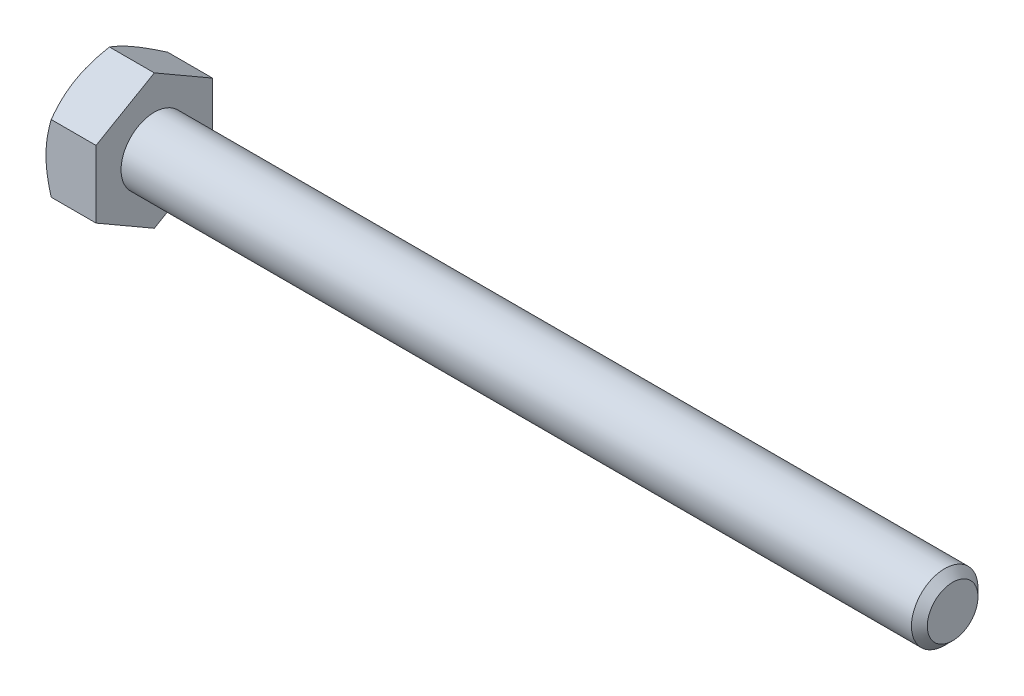
ISO-10303-21;
HEADER;
FILE_DESCRIPTION(('STEP AP214'),'2;1');
FILE_NAME('part.step','',(''),(''),'','','');
FILE_SCHEMA(('AUTOMOTIVE_DESIGN { 1 0 10303 214 1 1 1 1 }'));
ENDSEC;
DATA;
#1=APPLICATION_CONTEXT('core data for automotive mechanical design processes');
#2=APPLICATION_PROTOCOL_DEFINITION('international standard','automotive_design',2000,#1);
#3=PRODUCT_CONTEXT('',#1,'mechanical');
#4=PRODUCT('Part','Part','',(#3));
#5=PRODUCT_RELATED_PRODUCT_CATEGORY('part','',(#4));
#6=PRODUCT_DEFINITION_FORMATION('','',#4);
#7=PRODUCT_DEFINITION_CONTEXT('part definition',#1,'design');
#8=PRODUCT_DEFINITION('design','',#6,#7);
#9=PRODUCT_DEFINITION_SHAPE('','',#8);
#10=(LENGTH_UNIT() NAMED_UNIT(*) SI_UNIT(.MILLI.,.METRE.));
#11=(NAMED_UNIT(*) PLANE_ANGLE_UNIT() SI_UNIT($,.RADIAN.));
#12=(NAMED_UNIT(*) SI_UNIT($,.STERADIAN.) SOLID_ANGLE_UNIT());
#13=UNCERTAINTY_MEASURE_WITH_UNIT(LENGTH_MEASURE(1.E-05),#10,'distance_accuracy_value','');
#14=(GEOMETRIC_REPRESENTATION_CONTEXT(3) GLOBAL_UNCERTAINTY_ASSIGNED_CONTEXT((#13)) GLOBAL_UNIT_ASSIGNED_CONTEXT((#10,
#11,#12)) REPRESENTATION_CONTEXT('',''));
#15=CARTESIAN_POINT('',(0.,0.,0.));
#16=DIRECTION('',(0.,0.,1.));
#17=DIRECTION('',(1.,0.,0.));
#18=AXIS2_PLACEMENT_3D('',#15,#16,#17);
#19=CARTESIAN_POINT('',(4.7752,3.21156860739421,-5.5626));
#20=DIRECTION('',(0.,-0.866025403784438,0.500000000000001));
#21=DIRECTION('',(0.,-0.500000000000002,-0.866025403784438));
#22=AXIS2_PLACEMENT_3D('',#19,#20,#21);
#23=PLANE('',#22);
#24=CARTESIAN_POINT('',(0.496898061070145,6.42325268484227,0.0002));
#25=CARTESIAN_POINT('',(0.456146202255132,6.35265858120791,-0.122072574209491));
#26=CARTESIAN_POINT('',(0.417243775308724,6.2818012683745,-0.244801040124762));
#27=CARTESIAN_POINT('',(0.343647161560544,6.13951120287093,-0.491254662989244));
#28=CARTESIAN_POINT('',(0.308954790139046,6.06807821602766,-0.614980225538198));
#29=CARTESIAN_POINT('',(0.211873701066857,5.8526355064814,-0.988137944592621));
#30=CARTESIAN_POINT('',(0.156654841923374,5.70777535201369,-1.23904309212296));
#31=CARTESIAN_POINT('',(0.0919037861815295,5.49099476252076,-1.61451808721946));
#32=CARTESIAN_POINT('',(0.0734579983429358,5.419722058732,-1.7379660313744));
#33=CARTESIAN_POINT('',(0.0425268916674639,5.27685459691415,-1.98541973399132));
#34=CARTESIAN_POINT('',(0.03004104618901,5.20525986790489,-2.10942544218948));
#35=CARTESIAN_POINT('',(0.0113480299394723,5.06194605565758,-2.35765224642821));
#36=CARTESIAN_POINT('',(0.00513373340584859,4.9902272065059,-2.48187293701928));
#37=CARTESIAN_POINT('',(-0.000889599359094047,4.84672720555796,-2.7304222295473));
#38=CARTESIAN_POINT('',(-0.000698833448294769,4.7749460557547,-2.85475082803225));
#39=CARTESIAN_POINT('',(0.00862810136342433,4.57828637012706,-3.19537539533985));
#40=CARTESIAN_POINT('',(0.0242873955350771,4.4534722013835,-3.41155987710816));
#41=CARTESIAN_POINT('',(0.0739443233816063,4.20467287416474,-3.84249295274001));
#42=CARTESIAN_POINT('',(0.107958931423459,4.08068859075412,-4.05724003094723));
#43=CARTESIAN_POINT('',(0.192986041409677,3.83138850679899,-4.4890404426887));
#44=CARTESIAN_POINT('',(0.244358813937401,3.70610416511176,-4.70603928788379));
#45=CARTESIAN_POINT('',(0.360954456999594,3.45740388365365,-5.13680081122592));
#46=CARTESIAN_POINT('',(0.426149937617058,3.33398475856357,-5.35056900650764));
#47=CARTESIAN_POINT('',(0.496898061070138,3.21145313734037,-5.5628));
#48=B_SPLINE_CURVE_WITH_KNOTS('',3,(#24,#25,#26,#27,#28,#29,#30,#31,#32,#33,#34,#35,#36,#37,#38,
#39,#40,#41,#42,#43,#44,#45,#46,#47),.UNSPECIFIED.,.F.,.F.,(4,2,2,2,2,2,2,2,2,2,2,4),(0.,
0.440820118562271,0.881829648847401,1.76568130465017,2.19678242164486,2.62784543796583,
3.05841812523868,3.48897751176353,4.23854798324166,4.9888128227567,5.75571809391027,
6.52111769989992),.UNSPECIFIED.);
#49=CARTESIAN_POINT('',(0.49683139260579,6.42313721478843,0.));
#50=VERTEX_POINT('',#49);
#51=CARTESIAN_POINT('',(0.,4.81735291109131,-2.78130000000001));
#52=VERTEX_POINT('',#51);
#53=EDGE_CURVE('E47',#50,#52,#48,.T.);
#54=ORIENTED_EDGE('',*,*,#53,.F.);
#55=DIRECTION('',(-1.,0.,0.));
#56=VECTOR('',#55,1.);
#57=CARTESIAN_POINT('',(4.7752,6.42313721478843,0.));
#58=LINE('',#57,#56);
#59=CARTESIAN_POINT('',(4.7752,6.42313721478843,0.));
#60=VERTEX_POINT('',#59);
#61=EDGE_CURVE('E143',#60,#50,#58,.T.);
#62=ORIENTED_EDGE('',*,*,#61,.F.);
#63=DIRECTION('',(0.,0.500000000000001,0.866025403784438));
#64=VECTOR('',#63,1.);
#65=CARTESIAN_POINT('',(4.7752,3.21156860739421,-5.5626));
#66=LINE('',#65,#64);
#67=CARTESIAN_POINT('',(4.7752,3.21156860739421,-5.5626));
#68=VERTEX_POINT('',#67);
#69=EDGE_CURVE('E228',#68,#60,#66,.T.);
#70=ORIENTED_EDGE('',*,*,#69,.F.);
#71=DIRECTION('',(-1.,0.,0.));
#72=VECTOR('',#71,1.);
#73=CARTESIAN_POINT('',(4.7752,3.21156860739421,-5.5626));
#74=LINE('',#73,#72);
#75=CARTESIAN_POINT('',(0.496831392605783,3.21156860739421,-5.5626));
#76=VERTEX_POINT('',#75);
#77=EDGE_CURVE('E131',#68,#76,#74,.T.);
#78=ORIENTED_EDGE('',*,*,#77,.T.);
#79=EDGE_CURVE('E125',#52,#76,#48,.T.);
#80=ORIENTED_EDGE('',*,*,#79,.F.);
#81=EDGE_LOOP('',(#54,#62,#70,#78,#80));
#82=FACE_BOUND('',#81,.T.);
#83=ADVANCED_FACE('F31',(#82),#23,.F.);
#84=CARTESIAN_POINT('',(4.7752,6.42313721478843,0.));
#85=DIRECTION('',(0.,-0.866025403784438,-0.500000000000002));
#86=DIRECTION('',(0.,0.500000000000002,-0.866025403784438));
#87=AXIS2_PLACEMENT_3D('',#84,#85,#86);
#88=PLANE('',#87);
#89=CARTESIAN_POINT('',(0.496898061070137,3.21145313734037,5.5628));
#90=CARTESIAN_POINT('',(0.456146202255125,3.28204724097473,5.44052742579051));
#91=CARTESIAN_POINT('',(0.417243775308718,3.35290455380814,5.31779895987524));
#92=CARTESIAN_POINT('',(0.343647161560539,3.49519461931171,5.07134533701076));
#93=CARTESIAN_POINT('',(0.30895479013904,3.56662760615498,4.9476197744618));
#94=CARTESIAN_POINT('',(0.211873701066851,3.78207031570124,4.57446205540738));
#95=CARTESIAN_POINT('',(0.15665484192337,3.92693047016895,4.32355690787704));
#96=CARTESIAN_POINT('',(0.0919037861815258,4.14371105966188,3.94808191278055));
#97=CARTESIAN_POINT('',(0.0734579983429323,4.21498376345064,3.82463396862561));
#98=CARTESIAN_POINT('',(0.0425268916674611,4.35785122526849,3.57718026600868));
#99=CARTESIAN_POINT('',(0.0300410461890076,4.42944595427775,3.45317455781052));
#100=CARTESIAN_POINT('',(0.0113480299394705,4.57275976652506,3.20494775357179));
#101=CARTESIAN_POINT('',(0.00513373340584691,4.64447861567674,3.08072706298073));
#102=CARTESIAN_POINT('',(-0.000889599359095135,4.78797861662468,2.83217777045271));
#103=CARTESIAN_POINT('',(-0.000698833448295428,4.85975976642794,2.70784917196775));
#104=CARTESIAN_POINT('',(0.00862810136342448,5.05641945205558,2.36722460466016));
#105=CARTESIAN_POINT('',(0.0242873955350775,5.18123362079914,2.15104012289184));
#106=CARTESIAN_POINT('',(0.0739443233816076,5.4300329480179,1.72010704725999));
#107=CARTESIAN_POINT('',(0.107958931423461,5.55401723142852,1.50535996905278));
#108=CARTESIAN_POINT('',(0.192986041409681,5.80331731538366,1.0735595573113));
#109=CARTESIAN_POINT('',(0.244358813937406,5.92860165707088,0.856560712116214));
#110=CARTESIAN_POINT('',(0.360954456999599,6.17730193852899,0.425799188774085));
#111=CARTESIAN_POINT('',(0.426149937617065,6.30072106361907,0.212030993492364));
#112=CARTESIAN_POINT('',(0.496898061070145,6.42325268484227,-0.000200000000000452));
#113=B_SPLINE_CURVE_WITH_KNOTS('',3,(#89,#90,#91,#92,#93,#94,#95,#96,#97,#98,#99,#100,#101,#102,
#103,#104,#105,#106,#107,#108,#109,#110,#111,#112),.UNSPECIFIED.,.F.,.F.,(4,2,2,2,2,2,2,2,2,2,2,
4),(0.,0.440820118562269,0.881829648847399,1.76568130465016,2.19678242164486,2.62784543796583,
3.05841812523867,3.48897751176352,4.23854798324166,4.98881282275669,5.75571809391027,
6.52111769989993),.UNSPECIFIED.);
#114=CARTESIAN_POINT('',(0.496831392605783,3.21156860739421,5.5626));
#115=VERTEX_POINT('',#114);
#116=CARTESIAN_POINT('',(0.,4.81735291109131,2.78130000000001));
#117=VERTEX_POINT('',#116);
#118=EDGE_CURVE('E54',#115,#117,#113,.T.);
#119=ORIENTED_EDGE('',*,*,#118,.F.);
#120=DIRECTION('',(-1.,0.,0.));
#121=VECTOR('',#120,1.);
#122=CARTESIAN_POINT('',(4.7752,3.21156860739421,5.5626));
#123=LINE('',#122,#121);
#124=CARTESIAN_POINT('',(4.7752,3.21156860739421,5.5626));
#125=VERTEX_POINT('',#124);
#126=EDGE_CURVE('E141',#125,#115,#123,.T.);
#127=ORIENTED_EDGE('',*,*,#126,.F.);
#128=DIRECTION('',(0.,-0.500000000000002,0.866025403784438));
#129=VECTOR('',#128,1.);
#130=CARTESIAN_POINT('',(4.7752,6.42313721478843,0.));
#131=LINE('',#130,#129);
#132=EDGE_CURVE('E226',#60,#125,#131,.T.);
#133=ORIENTED_EDGE('',*,*,#132,.F.);
#134=ORIENTED_EDGE('',*,*,#61,.T.);
#135=EDGE_CURVE('E158',#117,#50,#113,.T.);
#136=ORIENTED_EDGE('',*,*,#135,.F.);
#137=EDGE_LOOP('',(#119,#127,#133,#134,#136));
#138=FACE_BOUND('',#137,.T.);
#139=ADVANCED_FACE('F164',(#138),#88,.F.);
#140=CARTESIAN_POINT('',(4.7752,3.21156860739421,5.5626));
#141=DIRECTION('',(0.,0.,-1.));
#142=DIRECTION('',(0.,1.,0.));
#143=AXIS2_PLACEMENT_3D('',#140,#141,#142);
#144=PLANE('',#143);
#145=CARTESIAN_POINT('',(2.76946298118782,-8.73931907134926,5.5626));
#146=CARTESIAN_POINT('',(2.65067477687311,-8.49536496294496,5.5626));
#147=CARTESIAN_POINT('',(2.53299354297042,-8.25086273134791,5.5626));
#148=CARTESIAN_POINT('',(2.30046552320843,-7.7604708971534,5.5626));
#149=CARTESIAN_POINT('',(2.18561916316987,-7.51458109286489,5.5626));
#150=CARTESIAN_POINT('',(1.95882765602869,-7.01990967591007,5.5626));
#151=CARTESIAN_POINT('',(1.8469007539214,-6.77111967039446,5.5626));
#152=CARTESIAN_POINT('',(1.62748022369642,-6.2715995272068,5.5626));
#153=CARTESIAN_POINT('',(1.51998639326666,-6.02086947869407,5.5626));
#154=CARTESIAN_POINT('',(1.30708686305049,-5.50862062515995,5.5626));
#155=CARTESIAN_POINT('',(1.2018721345633,-5.24702202730584,5.5626));
#156=CARTESIAN_POINT('',(0.999136458565238,-4.72080610690395,5.5626));
#157=CARTESIAN_POINT('',(0.901616358276672,-4.45618845560251,5.5626));
#158=CARTESIAN_POINT('',(0.716747076854938,-3.92397402586807,5.5626));
#159=CARTESIAN_POINT('',(0.629378259627776,-3.65638413416904,5.5626));
#160=CARTESIAN_POINT('',(0.467540995367502,-3.11736467394692,5.5626));
#161=CARTESIAN_POINT('',(0.393068603844484,-2.84593630702823,5.5626));
#162=CARTESIAN_POINT('',(0.260913640576687,-2.30059524037529,5.5626));
#163=CARTESIAN_POINT('',(0.203137923933969,-2.02670547196029,5.5626));
#164=CARTESIAN_POINT('',(0.107584140993962,-1.47536640605574,5.5626));
#165=CARTESIAN_POINT('',(0.0698039298235405,-1.19791749361908,5.5626));
#166=CARTESIAN_POINT('',(0.0306329033129829,-0.782024037078651,5.5626));
#167=CARTESIAN_POINT('',(0.0205033244370687,-0.644369603517899,5.5626));
#168=CARTESIAN_POINT('',(0.0060753924948423,-0.368760084714098,5.5626));
#169=CARTESIAN_POINT('',(0.00177648780683643,-0.230805029148983,5.5626));
#170=CARTESIAN_POINT('',(-0.00088241598890318,0.0451740110860491,5.5626));
#171=CARTESIAN_POINT('',(0.000758104200529116,0.183198000728104,5.5626));
#172=CARTESIAN_POINT('',(0.00993570123351545,0.459040077970908,5.5626));
#173=CARTESIAN_POINT('',(0.0174725517322426,0.596858173271942,5.5626));
#174=CARTESIAN_POINT('',(0.0422505226941699,0.924672766545149,5.5626));
#175=CARTESIAN_POINT('',(0.0620998981240967,1.11447655015001,5.5626));
#176=CARTESIAN_POINT('',(0.111925243451362,1.49274005777643,5.5626));
#177=CARTESIAN_POINT('',(0.141902492996073,1.68119960888146,5.5626));
#178=CARTESIAN_POINT('',(0.245441794558736,2.24430469004824,5.5626));
#179=CARTESIAN_POINT('',(0.3325951814541,2.61648783903803,5.5626));
#180=CARTESIAN_POINT('',(0.4845806566888,3.17327423069249,5.5626));
#181=CARTESIAN_POINT('',(0.539535147458612,3.36074033845109,5.5626));
#182=CARTESIAN_POINT('',(0.65536185695369,3.73385345225387,5.5626));
#183=CARTESIAN_POINT('',(0.716234120687406,3.91950044445069,5.5626));
#184=CARTESIAN_POINT('',(0.842902268347435,4.28903173945152,5.5626));
#185=CARTESIAN_POINT('',(0.908696733188397,4.47291653318727,5.5626));
#186=CARTESIAN_POINT('',(1.04441413237549,4.83914664715104,5.5626));
#187=CARTESIAN_POINT('',(1.11433697604312,5.02149200109189,5.5626));
#188=CARTESIAN_POINT('',(1.30616254116174,5.5078879993683,5.5626));
#189=CARTESIAN_POINT('',(1.43118964217263,5.81070521732177,5.5626));
#190=CARTESIAN_POINT('',(1.68847909791363,6.41326146392027,5.5626));
#191=CARTESIAN_POINT('',(1.82074222334613,6.7130001606208,5.5626));
#192=CARTESIAN_POINT('',(2.09080854329268,7.31009692856944,5.5626));
#193=CARTESIAN_POINT('',(2.22861377416229,7.60745407573435,5.5626));
#194=CARTESIAN_POINT('',(2.50845292532567,8.20015103027085,5.5626));
#195=CARTESIAN_POINT('',(2.65048668069894,8.4954909157686,5.5626));
#196=CARTESIAN_POINT('',(2.93809441051761,9.08501121024942,5.5626));
#197=CARTESIAN_POINT('',(3.08367358024025,9.37918907947537,5.5626));
#198=CARTESIAN_POINT('',(3.3774807874048,9.96621951539326,5.5626));
#199=CARTESIAN_POINT('',(3.52570884593012,10.2590720715133,5.5626));
#200=CARTESIAN_POINT('',(3.97349977739061,11.135883002068,5.5626));
#201=CARTESIAN_POINT('',(4.27623214013078,11.7182219913801,5.5626));
#202=CARTESIAN_POINT('',(4.85550678061973,12.8193647778852,5.5626));
#203=CARTESIAN_POINT('',(5.131489866857,13.3384641726992,5.5626));
#204=CARTESIAN_POINT('',(5.68680572725548,14.3749069841369,5.5626));
#205=CARTESIAN_POINT('',(5.96613869990832,14.8922502943533,5.5626));
#206=CARTESIAN_POINT('',(6.52636532569115,15.9238879354022,5.5626));
#207=CARTESIAN_POINT('',(6.80725082971984,16.438186698545,5.5626));
#208=CARTESIAN_POINT('',(7.37092859091901,17.4656872159849,5.5626));
#209=CARTESIAN_POINT('',(7.65372069975336,17.9788890516247,5.5626));
#210=CARTESIAN_POINT('',(7.93720779447483,18.4917042756102,5.5626));
#211=B_SPLINE_CURVE_WITH_KNOTS('',3,(#145,#146,#147,#148,#149,#150,#151,#152,#153,#154,#155,
#156,#157,#158,#159,#160,#161,#162,#163,#164,#165,#166,#167,#168,#169,#170,#171,#172,#173,#174,
#175,#176,#177,#178,#179,#180,#181,#182,#183,#184,#185,#186,#187,#188,#189,#190,#191,#192,#193,
#194,#195,#196,#197,#198,#199,#200,#201,#202,#203,#204,#205,#206,#207,#208,#209,#210),
.UNSPECIFIED.,.F.,.F.,(4,2,2,2,2,2,2,2,2,2,2,2,2,2,2,2,2,2,2,2,2,2,2,2,2,2,2,2,2,2,2,2,4),(0.,
0.814023059457575,1.62816765666496,2.44655638570204,3.26490772451191,4.1107076400708,
4.95660055342857,5.80082897227975,6.64479871831149,7.4839651145243,8.32304147698214,
8.73701667946676,9.15095271433074,9.56492494141957,9.97888127796806,10.5510771655991,
11.1233453766966,12.2684477407956,12.8544603586944,13.4404774339429,14.0263262050101,
14.6121621128824,15.5948602729038,16.577663303757,17.5608308091096,18.5439600191606,
19.5286286861599,20.5133051939663,22.4822323595086,24.2459312012703,26.0097350693916,
27.7677407284946,29.5256111556824),.UNSPECIFIED.);
#212=CARTESIAN_POINT('',(0.496831392605776,-3.21156860739418,5.5626));
#213=VERTEX_POINT('',#212);
#214=CARTESIAN_POINT('',(0.,0.,5.5626));
#215=VERTEX_POINT('',#214);
#216=EDGE_CURVE('E238',#213,#215,#211,.T.);
#217=ORIENTED_EDGE('',*,*,#216,.F.);
#218=DIRECTION('',(-1.,0.,0.));
#219=VECTOR('',#218,1.);
#220=CARTESIAN_POINT('',(4.7752,-3.21156860739418,5.5626));
#221=LINE('',#220,#219);
#222=CARTESIAN_POINT('',(4.7752,-3.21156860739418,5.5626));
#223=VERTEX_POINT('',#222);
#224=EDGE_CURVE('E133',#223,#213,#221,.T.);
#225=ORIENTED_EDGE('',*,*,#224,.F.);
#226=DIRECTION('',(0.,-1.,0.));
#227=VECTOR('',#226,1.);
#228=CARTESIAN_POINT('',(4.7752,3.21156860739421,5.5626));
#229=LINE('',#228,#227);
#230=EDGE_CURVE('E222',#125,#223,#229,.T.);
#231=ORIENTED_EDGE('',*,*,#230,.F.);
#232=ORIENTED_EDGE('',*,*,#126,.T.);
#233=EDGE_CURVE('E180',#215,#115,#211,.T.);
#234=ORIENTED_EDGE('',*,*,#233,.F.);
#235=EDGE_LOOP('',(#217,#225,#231,#232,#234));
#236=FACE_BOUND('',#235,.T.);
#237=ADVANCED_FACE('F244',(#236),#144,.F.);
#238=CARTESIAN_POINT('',(4.7752,-6.42313721478841,0.));
#239=DIRECTION('',(0.,0.866025403784438,-0.500000000000002));
#240=DIRECTION('',(0.,0.500000000000002,0.866025403784438));
#241=AXIS2_PLACEMENT_3D('',#238,#239,#240);
#242=PLANE('',#241);
#243=CARTESIAN_POINT('',(0.496898061070133,-6.42325268484225,-0.000200000000000067));
#244=CARTESIAN_POINT('',(0.45614620225512,-6.35265858120789,0.12207257420949));
#245=CARTESIAN_POINT('',(0.417243775308713,-6.28180126837448,0.244801040124761));
#246=CARTESIAN_POINT('',(0.343647161560533,-6.13951120287091,0.491254662989242));
#247=CARTESIAN_POINT('',(0.308954790139034,-6.06807821602764,0.614980225538195));
#248=CARTESIAN_POINT('',(0.211873701066845,-5.85263550648138,0.988137944592617));
#249=CARTESIAN_POINT('',(0.156654841923363,-5.70777535201367,1.23904309212296));
#250=CARTESIAN_POINT('',(0.0919037861815182,-5.49099476252074,1.61451808721945));
#251=CARTESIAN_POINT('',(0.0734579983429243,-5.41972205873198,1.73796603137439));
#252=CARTESIAN_POINT('',(0.0425268916674522,-5.27685459691413,1.98541973399131));
#253=CARTESIAN_POINT('',(0.0300410461889981,-5.20525986790487,2.10942544218947));
#254=CARTESIAN_POINT('',(0.0113480299394605,-5.06194605565756,2.3576522464282));
#255=CARTESIAN_POINT('',(0.00513373340583685,-4.99022720650589,2.48187293701927));
#256=CARTESIAN_POINT('',(-0.000889599359105341,-4.84672720555794,2.73042222954729));
#257=CARTESIAN_POINT('',(-0.000698833448305768,-4.77494605575468,2.85475082803224));
#258=CARTESIAN_POINT('',(0.00862810136341335,-4.57828637012704,3.19537539533984));
#259=CARTESIAN_POINT('',(0.0242873955350654,-4.45347220138349,3.41155987710815));
#260=CARTESIAN_POINT('',(0.0739443233815945,-4.20467287416472,3.84249295274001));
#261=CARTESIAN_POINT('',(0.107958931423448,-4.0806885907541,4.05724003094722));
#262=CARTESIAN_POINT('',(0.192986041409668,-3.83138850679897,4.48904044268869));
#263=CARTESIAN_POINT('',(0.244358813937392,-3.70610416511174,4.70603928788378));
#264=CARTESIAN_POINT('',(0.360954456999586,-3.45740388365363,5.13680081122591));
#265=CARTESIAN_POINT('',(0.426149937617051,-3.33398475856355,5.35056900650764));
#266=CARTESIAN_POINT('',(0.49689806107013,-3.21145313734035,5.5628));
#267=B_SPLINE_CURVE_WITH_KNOTS('',3,(#243,#244,#245,#246,#247,#248,#249,#250,#251,#252,#253,
#254,#255,#256,#257,#258,#259,#260,#261,#262,#263,#264,#265,#266),.UNSPECIFIED.,.F.,.F.,(4,2,2,
2,2,2,2,2,2,2,2,4),(0.,0.440820118562269,0.881829648847397,1.76568130465016,2.19678242164486,
2.62784543796582,3.05841812523867,3.48897751176352,4.23854798324165,4.98881282275669,
5.75571809391027,6.52111769989993),.UNSPECIFIED.);
#268=CARTESIAN_POINT('',(0.496831392605778,-6.42313721478841,0.));
#269=VERTEX_POINT('',#268);
#270=CARTESIAN_POINT('',(0.,-4.81735291109131,2.78130000000001));
#271=VERTEX_POINT('',#270);
#272=EDGE_CURVE('E166',#269,#271,#267,.T.);
#273=ORIENTED_EDGE('',*,*,#272,.F.);
#274=DIRECTION('',(-1.,0.,0.));
#275=VECTOR('',#274,1.);
#276=CARTESIAN_POINT('',(4.7752,-6.42313721478841,0.));
#277=LINE('',#276,#275);
#278=CARTESIAN_POINT('',(4.7752,-6.42313721478841,0.));
#279=VERTEX_POINT('',#278);
#280=EDGE_CURVE('E130',#279,#269,#277,.T.);
#281=ORIENTED_EDGE('',*,*,#280,.F.);
#282=DIRECTION('',(0.,-0.500000000000002,-0.866025403784438));
#283=VECTOR('',#282,1.);
#284=CARTESIAN_POINT('',(4.7752,-6.42313721478841,0.));
#285=LINE('',#284,#283);
#286=EDGE_CURVE('E220',#223,#279,#285,.T.);
#287=ORIENTED_EDGE('',*,*,#286,.F.);
#288=ORIENTED_EDGE('',*,*,#224,.T.);
#289=EDGE_CURVE('E168',#271,#213,#267,.T.);
#290=ORIENTED_EDGE('',*,*,#289,.F.);
#291=EDGE_LOOP('',(#273,#281,#287,#288,#290));
#292=FACE_BOUND('',#291,.T.);
#293=ADVANCED_FACE('F216',(#292),#242,.F.);
#294=CARTESIAN_POINT('',(4.7752,-3.21156860739421,-5.5626));
#295=DIRECTION('',(0.,0.866025403784439,0.499999999999999));
#296=DIRECTION('',(0.,-0.499999999999999,0.866025403784439));
#297=AXIS2_PLACEMENT_3D('',#294,#295,#296);
#298=PLANE('',#297);
#299=CARTESIAN_POINT('',(0.496898061070139,-3.21145313734037,-5.5628));
#300=CARTESIAN_POINT('',(0.456146202255127,-3.28204724097473,-5.44052742579051));
#301=CARTESIAN_POINT('',(0.417243775308719,-3.35290455380814,-5.31779895987524));
#302=CARTESIAN_POINT('',(0.343647161560539,-3.49519461931171,-5.07134533701076));
#303=CARTESIAN_POINT('',(0.30895479013904,-3.56662760615499,-4.9476197744618));
#304=CARTESIAN_POINT('',(0.211873701066851,-3.78207031570124,-4.57446205540738));
#305=CARTESIAN_POINT('',(0.15665484192337,-3.92693047016895,-4.32355690787704));
#306=CARTESIAN_POINT('',(0.0919037861815247,-4.14371105966188,-3.94808191278054));
#307=CARTESIAN_POINT('',(0.0734579983429302,-4.21498376345064,-3.8246339686256));
#308=CARTESIAN_POINT('',(0.0425268916674584,-4.35785122526849,-3.57718026600868));
#309=CARTESIAN_POINT('',(0.0300410461890051,-4.42944595427775,-3.45317455781052));
#310=CARTESIAN_POINT('',(0.0113480299394679,-4.57275976652506,-3.20494775357179));
#311=CARTESIAN_POINT('',(0.00513373340584384,-4.64447861567673,-3.08072706298072));
#312=CARTESIAN_POINT('',(-0.000889599359098822,-4.78797861662468,-2.8321777704527));
#313=CARTESIAN_POINT('',(-0.00069883344829927,-4.85975976642793,-2.70784917196775));
#314=CARTESIAN_POINT('',(0.00862810136342017,-5.05641945205557,-2.36722460466015));
#315=CARTESIAN_POINT('',(0.0242873955350727,-5.18123362079913,-2.15104012289184));
#316=CARTESIAN_POINT('',(0.073944323381602,-5.43003294801789,-1.72010704725998));
#317=CARTESIAN_POINT('',(0.107958931423455,-5.55401723142851,-1.50535996905277));
#318=CARTESIAN_POINT('',(0.192986041409674,-5.80331731538364,-1.0735595573113));
#319=CARTESIAN_POINT('',(0.244358813937398,-5.92860165707086,-0.856560712116212));
#320=CARTESIAN_POINT('',(0.36095445699959,-6.17730193852897,-0.425799188774083));
#321=CARTESIAN_POINT('',(0.426149937617054,-6.30072106361906,-0.212030993492363));
#322=CARTESIAN_POINT('',(0.496898061070133,-6.42325268484225,0.000200000000000195));
#323=B_SPLINE_CURVE_WITH_KNOTS('',3,(#299,#300,#301,#302,#303,#304,#305,#306,#307,#308,#309,
#310,#311,#312,#313,#314,#315,#316,#317,#318,#319,#320,#321,#322),.UNSPECIFIED.,.F.,.F.,(4,2,2,
2,2,2,2,2,2,2,2,4),(0.,0.44082011856227,0.881829648847399,1.76568130465016,2.19678242164486,
2.62784543796583,3.05841812523868,3.48897751176352,4.23854798324166,4.98881282275669,
5.75571809391027,6.52111769989992),.UNSPECIFIED.);
#324=CARTESIAN_POINT('',(0.496831392605575,-3.21156860739453,-5.5626));
#325=VERTEX_POINT('',#324);
#326=CARTESIAN_POINT('',(0.,-4.81735291109132,-2.78129999999999));
#327=VERTEX_POINT('',#326);
#328=EDGE_CURVE('E107',#325,#327,#323,.T.);
#329=ORIENTED_EDGE('',*,*,#328,.F.);
#330=DIRECTION('',(-1.,0.,0.));
#331=VECTOR('',#330,1.);
#332=CARTESIAN_POINT('',(4.7752,-3.21156860739421,-5.5626));
#333=LINE('',#332,#331);
#334=CARTESIAN_POINT('',(4.7752,-3.21156860739421,-5.5626));
#335=VERTEX_POINT('',#334);
#336=EDGE_CURVE('E121',#335,#325,#333,.T.);
#337=ORIENTED_EDGE('',*,*,#336,.F.);
#338=DIRECTION('',(0.,0.499999999999999,-0.866025403784439));
#339=VECTOR('',#338,1.);
#340=CARTESIAN_POINT('',(4.7752,-3.21156860739421,-5.5626));
#341=LINE('',#340,#339);
#342=EDGE_CURVE('E218',#279,#335,#341,.T.);
#343=ORIENTED_EDGE('',*,*,#342,.F.);
#344=ORIENTED_EDGE('',*,*,#280,.T.);
#345=EDGE_CURVE('E124',#327,#269,#323,.T.);
#346=ORIENTED_EDGE('',*,*,#345,.F.);
#347=EDGE_LOOP('',(#329,#337,#343,#344,#346));
#348=FACE_BOUND('',#347,.T.);
#349=ADVANCED_FACE('F119',(#348),#298,.F.);
#350=CARTESIAN_POINT('',(4.7752,3.21156860739421,-5.5626));
#351=DIRECTION('',(0.,0.,1.));
#352=DIRECTION('',(0.,-1.,0.));
#353=AXIS2_PLACEMENT_3D('',#350,#351,#352);
#354=PLANE('',#353);
#355=CARTESIAN_POINT('',(2.76946298300579,-8.73931907508182,-5.5626));
#356=CARTESIAN_POINT('',(2.65067477861528,-8.49536496655187,-5.5626));
#357=CARTESIAN_POINT('',(2.53299354463683,-8.25086273482909,-5.5626));
#358=CARTESIAN_POINT('',(2.30046552472368,-7.76047090038272,-5.5626));
#359=CARTESIAN_POINT('',(2.18561916460972,-7.51458109596809,-5.5626));
#360=CARTESIAN_POINT('',(1.95882765731771,-7.01990967875913,-5.5626));
#361=CARTESIAN_POINT('',(1.846900755135,-6.77111967311548,-5.5626));
#362=CARTESIAN_POINT('',(1.62748022476042,-6.27159952967088,-5.5626));
#363=CARTESIAN_POINT('',(1.51998639425648,-6.02086948102925,-5.5626));
#364=CARTESIAN_POINT('',(1.30708686388975,-5.50862062722724,-5.5626));
#365=CARTESIAN_POINT('',(1.20187213532635,-5.24702202923405,-5.5626));
#366=CARTESIAN_POINT('',(0.99913645917992,-4.72080610855178,-5.5626));
#367=CARTESIAN_POINT('',(0.901616358819191,-4.45618845710904,-5.5626));
#368=CARTESIAN_POINT('',(0.716747077259988,-3.92397402708937,-5.5626));
#369=CARTESIAN_POINT('',(0.629378259967501,-3.65638413524644,-5.5626));
#370=CARTESIAN_POINT('',(0.467540995587167,-3.11736467473259,-5.5626));
#371=CARTESIAN_POINT('',(0.393068604009408,-2.84593630766609,-5.5626));
#372=CARTESIAN_POINT('',(0.260913640631061,-2.3005952406421,-5.5626));
#373=CARTESIAN_POINT('',(0.203137923936715,-2.02670547200285,-5.5626));
#374=CARTESIAN_POINT('',(0.107584140927261,-1.47536640564425,-5.5626));
#375=CARTESIAN_POINT('',(0.0698039297389958,-1.19791749297779,-5.5626));
#376=CARTESIAN_POINT('',(0.0306329032322217,-0.782024036094227,-5.5626));
#377=CARTESIAN_POINT('',(0.0205033243625259,-0.644369602420758,-5.5626));
#378=CARTESIAN_POINT('',(0.00607539244269881,-0.368760083391737,-5.5626));
#379=CARTESIAN_POINT('',(0.00177648777087203,-0.230805027714118,-5.5626));
#380=CARTESIAN_POINT('',(-0.000882415982739008,0.0451740127451212,-5.5626));
#381=CARTESIAN_POINT('',(0.000758104232646094,0.183198002498879,-5.5626));
#382=CARTESIAN_POINT('',(0.00993570132662366,0.459040079963616,-5.5626));
#383=CARTESIAN_POINT('',(0.0174725518603885,0.596858175374882,-5.5626));
#384=CARTESIAN_POINT('',(0.042250522908457,0.924672768817533,-5.5626));
#385=CARTESIAN_POINT('',(0.062099898387905,1.11447655248113,-5.5626));
#386=CARTESIAN_POINT('',(0.11192524381685,1.49274006022233,-5.5626));
#387=CARTESIAN_POINT('',(0.14190249341372,1.68119961138341,-5.5626));
#388=CARTESIAN_POINT('',(0.245441795133937,2.24430469271527,-5.5626));
#389=CARTESIAN_POINT('',(0.332595182135703,2.61648784181074,-5.5626));
#390=CARTESIAN_POINT('',(0.484580657527371,3.17327423362326,-5.5626));
#391=CARTESIAN_POINT('',(0.539535148349866,3.36074034143568,-5.5626));
#392=CARTESIAN_POINT('',(0.65536185794868,3.73385345534551,-5.5626));
#393=CARTESIAN_POINT('',(0.71623412173345,3.91950044759555,-5.5626));
#394=CARTESIAN_POINT('',(0.842902269493737,4.28903174270241,-5.5626));
#395=CARTESIAN_POINT('',(0.908696734383901,4.47291653649097,-5.5626));
#396=CARTESIAN_POINT('',(1.04441413366767,4.83914665056039,-5.5626));
#397=CARTESIAN_POINT('',(1.11433697738277,5.02149200455406,-5.5626));
#398=CARTESIAN_POINT('',(1.30616254258248,5.5078880028608,-5.5626));
#399=CARTESIAN_POINT('',(1.43118964362202,5.8107052207933,-5.5626));
#400=CARTESIAN_POINT('',(1.68847909941208,6.41326146735255,-5.5626));
#401=CARTESIAN_POINT('',(1.82074222486501,6.71300016403479,-5.5626));
#402=CARTESIAN_POINT('',(2.09080854484644,7.31009693194882,-5.5626));
#403=CARTESIAN_POINT('',(2.22861377573049,7.60745407909739,-5.5626));
#404=CARTESIAN_POINT('',(2.50845292691854,8.20015103360299,-5.5626));
#405=CARTESIAN_POINT('',(2.65048668230202,8.49549091908616,-5.5626));
#406=CARTESIAN_POINT('',(2.93809441213761,9.08501121353829,-5.5626));
#407=CARTESIAN_POINT('',(3.08367358186692,9.37918908275012,-5.5626));
#408=CARTESIAN_POINT('',(3.37748078904248,9.96621951864084,-5.5626));
#409=CARTESIAN_POINT('',(3.52570884757214,10.2590720747479,-5.5626));
#410=CARTESIAN_POINT('',(3.97349977904316,11.1358830052649,-5.5626));
#411=CARTESIAN_POINT('',(4.27623214178692,11.7182219945536,-5.5626));
#412=CARTESIAN_POINT('',(4.85550678228881,12.8193647810355,-5.5626));
#413=CARTESIAN_POINT('',(5.13148986853601,13.3384641758492,-5.5626));
#414=CARTESIAN_POINT('',(5.68680572895232,14.3749069872875,-5.5626));
#415=CARTESIAN_POINT('',(5.96613870161306,14.8922502975047,-5.5626));
#416=CARTESIAN_POINT('',(6.52636532741208,15.9238879385591,-5.5626));
#417=CARTESIAN_POINT('',(6.80725083144907,16.4381867017065,-5.5626));
#418=CARTESIAN_POINT('',(7.37092859266394,17.4656872191565,-5.5626));
#419=CARTESIAN_POINT('',(7.65372070150567,17.9788890548015,-5.5626));
#420=CARTESIAN_POINT('',(7.93720779623423,18.4917042787924,-5.5626));
#421=B_SPLINE_CURVE_WITH_KNOTS('',3,(#355,#356,#357,#358,#359,#360,#361,#362,#363,#364,#365,
#366,#367,#368,#369,#370,#371,#372,#373,#374,#375,#376,#377,#378,#379,#380,#381,#382,#383,#384,
#385,#386,#387,#388,#389,#390,#391,#392,#393,#394,#395,#396,#397,#398,#399,#400,#401,#402,#403,
#404,#405,#406,#407,#408,#409,#410,#411,#412,#413,#414,#415,#416,#417,#418,#419,#420),
.UNSPECIFIED.,.F.,.F.,(4,2,2,2,2,2,2,2,2,2,2,2,2,2,2,2,2,2,2,2,2,2,2,2,2,2,2,2,2,2,2,2,4),(0.,
0.814023059896039,1.62816765754195,2.44655638702216,3.26490772627512,4.11070764230638,
4.95660055613668,5.80082897545884,6.6447987219612,7.48396511886283,8.32304148200849,
8.7370166848287,9.15095272002818,9.56492494745272,9.97888128433687,10.5510771721585,
11.1233453834466,12.2684477479276,12.8544603660259,13.4404774414739,14.0263262127401,
14.6121621208114,15.5948602808078,16.5776633116356,17.5608308169621,18.5439600269871,
19.5286286939573,20.5133052017346,22.4822323672198,24.245931208995,26.0097350771296,
27.7677407362569,29.5256111634693),.UNSPECIFIED.);
#422=CARTESIAN_POINT('',(0.,0.,-5.5626));
#423=VERTEX_POINT('',#422);
#424=EDGE_CURVE('E113',#76,#423,#421,.F.);
#425=ORIENTED_EDGE('',*,*,#424,.F.);
#426=ORIENTED_EDGE('',*,*,#77,.F.);
#427=DIRECTION('',(0.,1.,0.));
#428=VECTOR('',#427,1.);
#429=CARTESIAN_POINT('',(4.7752,3.21156860739421,-5.5626));
#430=LINE('',#429,#428);
#431=EDGE_CURVE('E129',#335,#68,#430,.T.);
#432=ORIENTED_EDGE('',*,*,#431,.F.);
#433=ORIENTED_EDGE('',*,*,#336,.T.);
#434=EDGE_CURVE('E104',#423,#325,#421,.F.);
#435=ORIENTED_EDGE('',*,*,#434,.F.);
#436=EDGE_LOOP('',(#425,#426,#432,#433,#435));
#437=FACE_BOUND('',#436,.T.);
#438=ADVANCED_FACE('F127',(#437),#354,.F.);
#439=CARTESIAN_POINT('',(4.7752,6.42313721478843,0.));
#440=DIRECTION('',(1.,0.,0.));
#441=DIRECTION('',(0.,0.,-1.));
#442=AXIS2_PLACEMENT_3D('',#439,#440,#441);
#443=PLANE('',#442);
#444=ORIENTED_EDGE('',*,*,#69,.T.);
#445=ORIENTED_EDGE('',*,*,#132,.T.);
#446=ORIENTED_EDGE('',*,*,#230,.T.);
#447=ORIENTED_EDGE('',*,*,#286,.T.);
#448=ORIENTED_EDGE('',*,*,#342,.T.);
#449=ORIENTED_EDGE('',*,*,#431,.T.);
#450=EDGE_LOOP('',(#444,#445,#446,#447,#448,#449));
#451=FACE_BOUND('',#450,.T.);
#452=CARTESIAN_POINT('',(4.7752,0.,0.));
#453=DIRECTION('',(1.,0.,0.));
#454=DIRECTION('',(0.,0.,-1.));
#455=AXIS2_PLACEMENT_3D('',#452,#453,#454);
#456=CIRCLE('',#455,3.175);
#457=CARTESIAN_POINT('',(4.7752,0.,-3.175));
#458=VERTEX_POINT('',#457);
#459=EDGE_CURVE('E231',#458,#458,#456,.F.);
#460=ORIENTED_EDGE('',*,*,#459,.T.);
#461=EDGE_LOOP('',(#460));
#462=FACE_BOUND('',#461,.T.);
#463=ADVANCED_FACE('F246',(#451,#462),#443,.T.);
#464=CARTESIAN_POINT('',(0.,0.,0.));
#465=DIRECTION('',(-1.,0.,0.));
#466=DIRECTION('',(0.,0.,1.));
#467=AXIS2_PLACEMENT_3D('',#464,#465,#466);
#468=CYLINDRICAL_SURFACE('',#467,3.175);
#469=ORIENTED_EDGE('',*,*,#459,.F.);
#470=EDGE_LOOP('',(#469));
#471=FACE_BOUND('',#470,.T.);
#472=CARTESIAN_POINT('',(80.21955,0.,0.));
#473=DIRECTION('',(-1.,0.,0.));
#474=DIRECTION('',(0.,0.,1.));
#475=AXIS2_PLACEMENT_3D('',#472,#473,#474);
#476=CIRCLE('',#475,3.175);
#477=CARTESIAN_POINT('',(80.21955,0.,3.175));
#478=VERTEX_POINT('',#477);
#479=EDGE_CURVE('E234',#478,#478,#476,.T.);
#480=ORIENTED_EDGE('',*,*,#479,.T.);
#481=EDGE_LOOP('',(#480));
#482=FACE_BOUND('',#481,.T.);
#483=ADVANCED_FACE('F278',(#471,#482),#468,.T.);
#484=CARTESIAN_POINT('',(80.9752,0.,0.));
#485=DIRECTION('',(-1.,0.,0.));
#486=DIRECTION('',(0.,0.,1.));
#487=AXIS2_PLACEMENT_3D('',#484,#485,#486);
#488=CONICAL_SURFACE('',#487,2.41935,0.785398163397424);
#489=ORIENTED_EDGE('',*,*,#479,.F.);
#490=EDGE_LOOP('',(#489));
#491=FACE_BOUND('',#490,.T.);
#492=CARTESIAN_POINT('',(80.9752,0.,0.));
#493=DIRECTION('',(-1.,0.,0.));
#494=DIRECTION('',(0.,0.,1.));
#495=AXIS2_PLACEMENT_3D('',#492,#493,#494);
#496=CIRCLE('',#495,2.41935);
#497=CARTESIAN_POINT('',(80.9752,0.,2.41935));
#498=VERTEX_POINT('',#497);
#499=EDGE_CURVE('E236',#498,#498,#496,.T.);
#500=ORIENTED_EDGE('',*,*,#499,.T.);
#501=EDGE_LOOP('',(#500));
#502=FACE_BOUND('',#501,.T.);
#503=ADVANCED_FACE('F280',(#491,#502),#488,.T.);
#504=CARTESIAN_POINT('',(80.9752,0.,0.));
#505=DIRECTION('',(-1.,0.,0.));
#506=DIRECTION('',(0.,0.,1.));
#507=AXIS2_PLACEMENT_3D('',#504,#505,#506);
#508=PLANE('',#507);
#509=ORIENTED_EDGE('',*,*,#499,.F.);
#510=EDGE_LOOP('',(#509));
#511=FACE_BOUND('',#510,.T.);
#512=ADVANCED_FACE('F193',(#511),#508,.F.);
#513=CARTESIAN_POINT('',(0.,0.,0.));
#514=DIRECTION('',(1.,0.,0.));
#515=DIRECTION('',(0.,0.,-1.));
#516=AXIS2_PLACEMENT_3D('',#513,#514,#515);
#517=CONICAL_SURFACE('',#516,5.5626,1.0471975511966);
#518=ORIENTED_EDGE('',*,*,#328,.T.);
#519=CARTESIAN_POINT('',(0.,0.,0.));
#520=DIRECTION('',(1.,0.,0.));
#521=DIRECTION('',(0.,0.,-1.));
#522=AXIS2_PLACEMENT_3D('',#519,#520,#521);
#523=CIRCLE('',#522,5.5626);
#524=EDGE_CURVE('E35',#327,#423,#523,.T.);
#525=ORIENTED_EDGE('',*,*,#524,.T.);
#526=ORIENTED_EDGE('',*,*,#434,.T.);
#527=EDGE_LOOP('',(#518,#525,#526));
#528=FACE_BOUND('',#527,.T.);
#529=ADVANCED_FACE('F106',(#528),#517,.T.);
#530=ORIENTED_EDGE('',*,*,#272,.T.);
#531=EDGE_CURVE('E148',#271,#327,#523,.T.);
#532=ORIENTED_EDGE('',*,*,#531,.T.);
#533=ORIENTED_EDGE('',*,*,#345,.T.);
#534=EDGE_LOOP('',(#530,#532,#533));
#535=FACE_BOUND('',#534,.T.);
#536=ADVANCED_FACE('F192',(#535),#517,.T.);
#537=ORIENTED_EDGE('',*,*,#216,.T.);
#538=EDGE_CURVE('E149',#215,#271,#523,.T.);
#539=ORIENTED_EDGE('',*,*,#538,.T.);
#540=ORIENTED_EDGE('',*,*,#289,.T.);
#541=EDGE_LOOP('',(#537,#539,#540));
#542=FACE_BOUND('',#541,.T.);
#543=ADVANCED_FACE('F187',(#542),#517,.T.);
#544=ORIENTED_EDGE('',*,*,#233,.T.);
#545=ORIENTED_EDGE('',*,*,#118,.T.);
#546=CARTESIAN_POINT('',(0.,0.,0.));
#547=DIRECTION('',(-1.,0.,0.));
#548=DIRECTION('',(0.,0.,1.));
#549=AXIS2_PLACEMENT_3D('',#546,#547,#548);
#550=CIRCLE('',#549,5.5626);
#551=EDGE_CURVE('E114',#215,#117,#550,.T.);
#552=ORIENTED_EDGE('',*,*,#551,.F.);
#553=EDGE_LOOP('',(#544,#545,#552));
#554=FACE_BOUND('',#553,.T.);
#555=ADVANCED_FACE('F191',(#554),#517,.T.);
#556=ORIENTED_EDGE('',*,*,#135,.T.);
#557=ORIENTED_EDGE('',*,*,#53,.T.);
#558=EDGE_CURVE('E40',#52,#117,#523,.T.);
#559=ORIENTED_EDGE('',*,*,#558,.T.);
#560=EDGE_LOOP('',(#556,#557,#559));
#561=FACE_BOUND('',#560,.T.);
#562=ADVANCED_FACE('F157',(#561),#517,.T.);
#563=ORIENTED_EDGE('',*,*,#79,.T.);
#564=ORIENTED_EDGE('',*,*,#424,.T.);
#565=EDGE_CURVE('E11',#423,#52,#523,.T.);
#566=ORIENTED_EDGE('',*,*,#565,.T.);
#567=EDGE_LOOP('',(#563,#564,#566));
#568=FACE_BOUND('',#567,.T.);
#569=ADVANCED_FACE('F250',(#568),#517,.T.);
#570=CARTESIAN_POINT('',(0.,6.42313721478843,0.));
#571=DIRECTION('',(1.,0.,0.));
#572=DIRECTION('',(0.,0.,-1.));
#573=AXIS2_PLACEMENT_3D('',#570,#571,#572);
#574=PLANE('',#573);
#575=ORIENTED_EDGE('',*,*,#565,.F.);
#576=ORIENTED_EDGE('',*,*,#524,.F.);
#577=ORIENTED_EDGE('',*,*,#531,.F.);
#578=ORIENTED_EDGE('',*,*,#538,.F.);
#579=ORIENTED_EDGE('',*,*,#551,.T.);
#580=ORIENTED_EDGE('',*,*,#558,.F.);
#581=EDGE_LOOP('',(#575,#576,#577,#578,#579,#580));
#582=FACE_BOUND('',#581,.T.);
#583=ADVANCED_FACE('F161',(#582),#574,.F.);
#584=CLOSED_SHELL('',(#83,#139,#237,#293,#349,#438,#463,#483,#503,#512,#529,#536,#543,#555,#562,
#569,#583));
#585=MANIFOLD_SOLID_BREP('B2',#584);
#586=ADVANCED_BREP_SHAPE_REPRESENTATION('',(#18,#585),#14);
#587=SHAPE_DEFINITION_REPRESENTATION(#9,#586);
ENDSEC;
END-ISO-10303-21;
